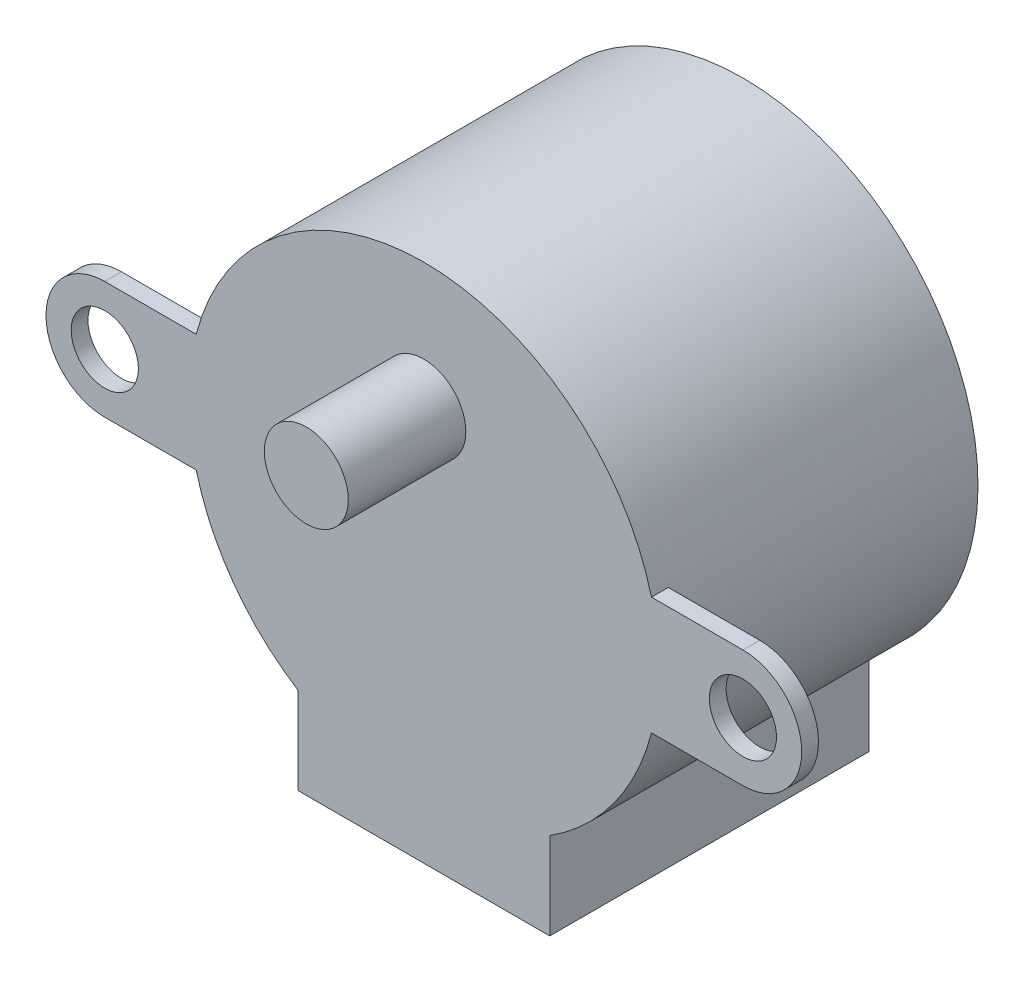
ISO-10303-21;
HEADER;
FILE_DESCRIPTION(('STEP AP214'),'2;1');
FILE_NAME('part.step','',(''),(''),'','','');
FILE_SCHEMA(('AUTOMOTIVE_DESIGN { 1 0 10303 214 1 1 1 1 }'));
ENDSEC;
DATA;
#1=APPLICATION_CONTEXT('core data for automotive mechanical design processes');
#2=APPLICATION_PROTOCOL_DEFINITION('international standard','automotive_design',2000,#1);
#3=PRODUCT_CONTEXT('',#1,'mechanical');
#4=PRODUCT('Part','Part','',(#3));
#5=PRODUCT_RELATED_PRODUCT_CATEGORY('part','',(#4));
#6=PRODUCT_DEFINITION_FORMATION('','',#4);
#7=PRODUCT_DEFINITION_CONTEXT('part definition',#1,'design');
#8=PRODUCT_DEFINITION('design','',#6,#7);
#9=PRODUCT_DEFINITION_SHAPE('','',#8);
#10=(LENGTH_UNIT() NAMED_UNIT(*) SI_UNIT(.MILLI.,.METRE.));
#11=(NAMED_UNIT(*) PLANE_ANGLE_UNIT() SI_UNIT($,.RADIAN.));
#12=(NAMED_UNIT(*) SI_UNIT($,.STERADIAN.) SOLID_ANGLE_UNIT());
#13=UNCERTAINTY_MEASURE_WITH_UNIT(LENGTH_MEASURE(1.E-05),#10,'distance_accuracy_value','');
#14=(GEOMETRIC_REPRESENTATION_CONTEXT(3) GLOBAL_UNCERTAINTY_ASSIGNED_CONTEXT((#13)) GLOBAL_UNIT_ASSIGNED_CONTEXT((#10,
#11,#12)) REPRESENTATION_CONTEXT('',''));
#15=CARTESIAN_POINT('',(0.,0.,0.));
#16=DIRECTION('',(0.,0.,1.));
#17=DIRECTION('',(1.,0.,0.));
#18=AXIS2_PLACEMENT_3D('',#15,#16,#17);
#19=CARTESIAN_POINT('',(19.,0.,19.));
#20=DIRECTION('',(0.,0.,-1.));
#21=DIRECTION('',(-1.,0.,0.));
#22=AXIS2_PLACEMENT_3D('',#19,#20,#21);
#23=CYLINDRICAL_SURFACE('',#22,3.5);
#24=CARTESIAN_POINT('',(19.,0.,18.));
#25=DIRECTION('',(0.,0.,-1.));
#26=DIRECTION('',(-1.,0.,0.));
#27=AXIS2_PLACEMENT_3D('',#24,#25,#26);
#28=CIRCLE('',#27,3.5);
#29=CARTESIAN_POINT('',(19.,3.5,18.));
#30=VERTEX_POINT('',#29);
#31=CARTESIAN_POINT('',(19.,-3.5,18.));
#32=VERTEX_POINT('',#31);
#33=EDGE_CURVE('E49',#30,#32,#28,.T.);
#34=ORIENTED_EDGE('',*,*,#33,.F.);
#35=DIRECTION('',(0.,0.,-1.));
#36=VECTOR('',#35,1.);
#37=CARTESIAN_POINT('',(19.,3.5,19.));
#38=LINE('',#37,#36);
#39=CARTESIAN_POINT('',(19.,3.5,19.));
#40=VERTEX_POINT('',#39);
#41=EDGE_CURVE('E11',#40,#30,#38,.T.);
#42=ORIENTED_EDGE('',*,*,#41,.F.);
#43=CARTESIAN_POINT('',(19.,0.,19.));
#44=DIRECTION('',(0.,0.,1.));
#45=DIRECTION('',(1.,0.,0.));
#46=AXIS2_PLACEMENT_3D('',#43,#44,#45);
#47=CIRCLE('',#46,3.5);
#48=CARTESIAN_POINT('',(19.,-3.5,19.));
#49=VERTEX_POINT('',#48);
#50=EDGE_CURVE('E148',#49,#40,#47,.T.);
#51=ORIENTED_EDGE('',*,*,#50,.F.);
#52=DIRECTION('',(0.,0.,-1.));
#53=VECTOR('',#52,1.);
#54=CARTESIAN_POINT('',(19.,-3.5,19.));
#55=LINE('',#54,#53);
#56=EDGE_CURVE('E135',#49,#32,#55,.T.);
#57=ORIENTED_EDGE('',*,*,#56,.T.);
#58=EDGE_LOOP('',(#34,#42,#51,#57));
#59=FACE_BOUND('',#58,.T.);
#60=ADVANCED_FACE('F33',(#59),#23,.T.);
#61=CARTESIAN_POINT('',(19.,3.5,19.));
#62=DIRECTION('',(0.,-1.,0.));
#63=DIRECTION('',(0.,0.,-1.));
#64=AXIS2_PLACEMENT_3D('',#61,#62,#63);
#65=PLANE('',#64);
#66=DIRECTION('',(1.,0.,0.));
#67=VECTOR('',#66,1.);
#68=CARTESIAN_POINT('',(13.555441711726,3.5,18.));
#69=LINE('',#68,#67);
#70=CARTESIAN_POINT('',(13.555441711726,3.5,18.));
#71=VERTEX_POINT('',#70);
#72=EDGE_CURVE('E250',#71,#30,#69,.T.);
#73=ORIENTED_EDGE('',*,*,#72,.F.);
#74=DIRECTION('',(0.,0.,-1.));
#75=VECTOR('',#74,1.);
#76=CARTESIAN_POINT('',(13.555441711726,3.5,19.));
#77=LINE('',#76,#75);
#78=CARTESIAN_POINT('',(13.555441711726,3.5,19.));
#79=VERTEX_POINT('',#78);
#80=EDGE_CURVE('E41',#79,#71,#77,.T.);
#81=ORIENTED_EDGE('',*,*,#80,.F.);
#82=DIRECTION('',(-1.,0.,0.));
#83=VECTOR('',#82,1.);
#84=CARTESIAN_POINT('',(19.,3.5,19.));
#85=LINE('',#84,#83);
#86=EDGE_CURVE('E87',#40,#79,#85,.T.);
#87=ORIENTED_EDGE('',*,*,#86,.F.);
#88=ORIENTED_EDGE('',*,*,#41,.T.);
#89=EDGE_LOOP('',(#73,#81,#87,#88));
#90=FACE_BOUND('',#89,.T.);
#91=ADVANCED_FACE('F249',(#90),#65,.F.);
#92=CARTESIAN_POINT('',(13.555441711726,-3.5,19.));
#93=DIRECTION('',(0.,1.,0.));
#94=DIRECTION('',(0.,0.,1.));
#95=AXIS2_PLACEMENT_3D('',#92,#93,#94);
#96=PLANE('',#95);
#97=DIRECTION('',(-1.,0.,0.));
#98=VECTOR('',#97,1.);
#99=CARTESIAN_POINT('',(13.555441711726,-3.5,18.));
#100=LINE('',#99,#98);
#101=CARTESIAN_POINT('',(13.555441711726,-3.5,18.));
#102=VERTEX_POINT('',#101);
#103=EDGE_CURVE('E254',#32,#102,#100,.T.);
#104=ORIENTED_EDGE('',*,*,#103,.F.);
#105=ORIENTED_EDGE('',*,*,#56,.F.);
#106=DIRECTION('',(1.,0.,0.));
#107=VECTOR('',#106,1.);
#108=CARTESIAN_POINT('',(13.555441711726,-3.5,19.));
#109=LINE('',#108,#107);
#110=CARTESIAN_POINT('',(13.555441711726,-3.50000000000001,19.));
#111=VERTEX_POINT('',#110);
#112=EDGE_CURVE('E58',#111,#49,#109,.T.);
#113=ORIENTED_EDGE('',*,*,#112,.F.);
#114=DIRECTION('',(0.,0.,-1.));
#115=VECTOR('',#114,1.);
#116=CARTESIAN_POINT('',(13.555441711726,-3.50000000000001,19.));
#117=LINE('',#116,#115);
#118=EDGE_CURVE('E129',#111,#102,#117,.T.);
#119=ORIENTED_EDGE('',*,*,#118,.T.);
#120=EDGE_LOOP('',(#104,#105,#113,#119));
#121=FACE_BOUND('',#120,.T.);
#122=ADVANCED_FACE('F285',(#121),#96,.F.);
#123=CARTESIAN_POINT('',(19.,0.,19.));
#124=DIRECTION('',(0.,0.,-1.));
#125=DIRECTION('',(-1.,0.,0.));
#126=AXIS2_PLACEMENT_3D('',#123,#124,#125);
#127=CYLINDRICAL_SURFACE('',#126,2.);
#128=CARTESIAN_POINT('',(19.,0.,19.));
#129=DIRECTION('',(0.,0.,1.));
#130=DIRECTION('',(1.,0.,0.));
#131=AXIS2_PLACEMENT_3D('',#128,#129,#130);
#132=CIRCLE('',#131,2.);
#133=CARTESIAN_POINT('',(21.,0.,19.));
#134=VERTEX_POINT('',#133);
#135=EDGE_CURVE('E142',#134,#134,#132,.T.);
#136=ORIENTED_EDGE('',*,*,#135,.T.);
#137=EDGE_LOOP('',(#136));
#138=FACE_BOUND('',#137,.T.);
#139=CARTESIAN_POINT('',(19.,0.,18.));
#140=DIRECTION('',(0.,0.,-1.));
#141=DIRECTION('',(-1.,0.,0.));
#142=AXIS2_PLACEMENT_3D('',#139,#140,#141);
#143=CIRCLE('',#142,2.);
#144=CARTESIAN_POINT('',(17.,0.,18.));
#145=VERTEX_POINT('',#144);
#146=EDGE_CURVE('E36',#145,#145,#143,.T.);
#147=ORIENTED_EDGE('',*,*,#146,.T.);
#148=EDGE_LOOP('',(#147));
#149=FACE_BOUND('',#148,.T.);
#150=ADVANCED_FACE('F265',(#138,#149),#127,.F.);
#151=CARTESIAN_POINT('',(-19.,3.5,19.));
#152=DIRECTION('',(0.,-1.,0.));
#153=DIRECTION('',(0.,0.,-1.));
#154=AXIS2_PLACEMENT_3D('',#151,#152,#153);
#155=PLANE('',#154);
#156=DIRECTION('',(1.,0.,0.));
#157=VECTOR('',#156,1.);
#158=CARTESIAN_POINT('',(-13.555441711726,3.5,18.));
#159=LINE('',#158,#157);
#160=CARTESIAN_POINT('',(-19.,3.5,18.));
#161=VERTEX_POINT('',#160);
#162=CARTESIAN_POINT('',(-13.555441711726,3.5,18.));
#163=VERTEX_POINT('',#162);
#164=EDGE_CURVE('E175',#161,#163,#159,.T.);
#165=ORIENTED_EDGE('',*,*,#164,.F.);
#166=DIRECTION('',(0.,0.,-1.));
#167=VECTOR('',#166,1.);
#168=CARTESIAN_POINT('',(-19.,3.5,19.));
#169=LINE('',#168,#167);
#170=CARTESIAN_POINT('',(-19.,3.5,19.));
#171=VERTEX_POINT('',#170);
#172=EDGE_CURVE('E165',#171,#161,#169,.T.);
#173=ORIENTED_EDGE('',*,*,#172,.F.);
#174=DIRECTION('',(-1.,0.,0.));
#175=VECTOR('',#174,1.);
#176=CARTESIAN_POINT('',(-19.,3.5,19.));
#177=LINE('',#176,#175);
#178=CARTESIAN_POINT('',(-13.555441711726,3.5,19.));
#179=VERTEX_POINT('',#178);
#180=EDGE_CURVE('E202',#179,#171,#177,.T.);
#181=ORIENTED_EDGE('',*,*,#180,.F.);
#182=DIRECTION('',(0.,0.,-1.));
#183=VECTOR('',#182,1.);
#184=CARTESIAN_POINT('',(-13.555441711726,3.5,19.));
#185=LINE('',#184,#183);
#186=EDGE_CURVE('E168',#179,#163,#185,.T.);
#187=ORIENTED_EDGE('',*,*,#186,.T.);
#188=EDGE_LOOP('',(#165,#173,#181,#187));
#189=FACE_BOUND('',#188,.T.);
#190=ADVANCED_FACE('F242',(#189),#155,.F.);
#191=CARTESIAN_POINT('',(-19.,0.,19.));
#192=DIRECTION('',(0.,0.,-1.));
#193=DIRECTION('',(-1.,0.,0.));
#194=AXIS2_PLACEMENT_3D('',#191,#192,#193);
#195=CYLINDRICAL_SURFACE('',#194,3.5);
#196=CARTESIAN_POINT('',(-19.,0.,18.));
#197=DIRECTION('',(0.,0.,-1.));
#198=DIRECTION('',(-1.,0.,0.));
#199=AXIS2_PLACEMENT_3D('',#196,#197,#198);
#200=CIRCLE('',#199,3.5);
#201=CARTESIAN_POINT('',(-19.,-3.5,18.));
#202=VERTEX_POINT('',#201);
#203=EDGE_CURVE('E174',#202,#161,#200,.T.);
#204=ORIENTED_EDGE('',*,*,#203,.F.);
#205=DIRECTION('',(0.,0.,-1.));
#206=VECTOR('',#205,1.);
#207=CARTESIAN_POINT('',(-19.,-3.5,19.));
#208=LINE('',#207,#206);
#209=CARTESIAN_POINT('',(-19.,-3.5,19.));
#210=VERTEX_POINT('',#209);
#211=EDGE_CURVE('E162',#210,#202,#208,.T.);
#212=ORIENTED_EDGE('',*,*,#211,.F.);
#213=CARTESIAN_POINT('',(-19.,0.,19.));
#214=DIRECTION('',(0.,0.,1.));
#215=DIRECTION('',(-1.,0.,0.));
#216=AXIS2_PLACEMENT_3D('',#213,#214,#215);
#217=CIRCLE('',#216,3.5);
#218=EDGE_CURVE('E204',#171,#210,#217,.T.);
#219=ORIENTED_EDGE('',*,*,#218,.F.);
#220=ORIENTED_EDGE('',*,*,#172,.T.);
#221=EDGE_LOOP('',(#204,#212,#219,#220));
#222=FACE_BOUND('',#221,.T.);
#223=ADVANCED_FACE('F237',(#222),#195,.T.);
#224=CARTESIAN_POINT('',(-13.555441711726,-3.5,19.));
#225=DIRECTION('',(0.,1.,0.));
#226=DIRECTION('',(0.,0.,1.));
#227=AXIS2_PLACEMENT_3D('',#224,#225,#226);
#228=PLANE('',#227);
#229=DIRECTION('',(-1.,0.,0.));
#230=VECTOR('',#229,1.);
#231=CARTESIAN_POINT('',(-13.555441711726,-3.5,18.));
#232=LINE('',#231,#230);
#233=CARTESIAN_POINT('',(-13.555441711726,-3.5,18.));
#234=VERTEX_POINT('',#233);
#235=EDGE_CURVE('E182',#234,#202,#232,.T.);
#236=ORIENTED_EDGE('',*,*,#235,.F.);
#237=DIRECTION('',(0.,0.,-1.));
#238=VECTOR('',#237,1.);
#239=CARTESIAN_POINT('',(-13.555441711726,-3.5,19.));
#240=LINE('',#239,#238);
#241=CARTESIAN_POINT('',(-13.555441711726,-3.5,19.));
#242=VERTEX_POINT('',#241);
#243=EDGE_CURVE('E159',#242,#234,#240,.T.);
#244=ORIENTED_EDGE('',*,*,#243,.F.);
#245=DIRECTION('',(1.,0.,0.));
#246=VECTOR('',#245,1.);
#247=CARTESIAN_POINT('',(-13.555441711726,-3.5,19.));
#248=LINE('',#247,#246);
#249=EDGE_CURVE('E206',#210,#242,#248,.T.);
#250=ORIENTED_EDGE('',*,*,#249,.F.);
#251=ORIENTED_EDGE('',*,*,#211,.T.);
#252=EDGE_LOOP('',(#236,#244,#250,#251));
#253=FACE_BOUND('',#252,.T.);
#254=ADVANCED_FACE('F231',(#253),#228,.F.);
#255=CARTESIAN_POINT('',(-19.,0.,19.));
#256=DIRECTION('',(0.,0.,-1.));
#257=DIRECTION('',(-1.,0.,0.));
#258=AXIS2_PLACEMENT_3D('',#255,#256,#257);
#259=CYLINDRICAL_SURFACE('',#258,2.);
#260=CARTESIAN_POINT('',(-19.,0.,19.));
#261=DIRECTION('',(0.,0.,1.));
#262=DIRECTION('',(-1.,0.,0.));
#263=AXIS2_PLACEMENT_3D('',#260,#261,#262);
#264=CIRCLE('',#263,2.);
#265=CARTESIAN_POINT('',(-21.,0.,19.));
#266=VERTEX_POINT('',#265);
#267=EDGE_CURVE('E179',#266,#266,#264,.T.);
#268=ORIENTED_EDGE('',*,*,#267,.T.);
#269=EDGE_LOOP('',(#268));
#270=FACE_BOUND('',#269,.T.);
#271=CARTESIAN_POINT('',(-19.,0.,18.));
#272=DIRECTION('',(0.,0.,-1.));
#273=DIRECTION('',(-1.,0.,0.));
#274=AXIS2_PLACEMENT_3D('',#271,#272,#273);
#275=CIRCLE('',#274,2.);
#276=CARTESIAN_POINT('',(-21.,0.,18.));
#277=VERTEX_POINT('',#276);
#278=EDGE_CURVE('E172',#277,#277,#275,.T.);
#279=ORIENTED_EDGE('',*,*,#278,.T.);
#280=EDGE_LOOP('',(#279));
#281=FACE_BOUND('',#280,.T.);
#282=ADVANCED_FACE('F309',(#270,#281),#259,.F.);
#283=CARTESIAN_POINT('',(19.,0.,19.));
#284=DIRECTION('',(0.,0.,1.));
#285=DIRECTION('',(1.,0.,0.));
#286=AXIS2_PLACEMENT_3D('',#283,#284,#285);
#287=PLANE('',#286);
#288=CARTESIAN_POINT('',(0.,6.5,19.));
#289=DIRECTION('',(0.,0.,1.));
#290=DIRECTION('',(1.,0.,0.));
#291=AXIS2_PLACEMENT_3D('',#288,#289,#290);
#292=CIRCLE('',#291,2.5);
#293=CARTESIAN_POINT('',(2.5,6.5,19.));
#294=VERTEX_POINT('',#293);
#295=EDGE_CURVE('E390',#294,#294,#292,.T.);
#296=ORIENTED_EDGE('',*,*,#295,.F.);
#297=EDGE_LOOP('',(#296));
#298=FACE_BOUND('',#297,.T.);
#299=ORIENTED_EDGE('',*,*,#135,.F.);
#300=EDGE_LOOP('',(#299));
#301=FACE_BOUND('',#300,.T.);
#302=ORIENTED_EDGE('',*,*,#50,.T.);
#303=ORIENTED_EDGE('',*,*,#86,.T.);
#304=CARTESIAN_POINT('',(0.,0.,19.));
#305=DIRECTION('',(0.,0.,1.));
#306=DIRECTION('',(1.,0.,0.));
#307=AXIS2_PLACEMENT_3D('',#304,#305,#306);
#308=CIRCLE('',#307,14.);
#309=EDGE_CURVE('E200',#79,#179,#308,.T.);
#310=ORIENTED_EDGE('',*,*,#309,.T.);
#311=ORIENTED_EDGE('',*,*,#180,.T.);
#312=ORIENTED_EDGE('',*,*,#218,.T.);
#313=ORIENTED_EDGE('',*,*,#249,.T.);
#314=CARTESIAN_POINT('',(0.,0.,19.));
#315=DIRECTION('',(0.,0.,1.));
#316=DIRECTION('',(1.,0.,0.));
#317=AXIS2_PLACEMENT_3D('',#314,#315,#316);
#318=CIRCLE('',#317,14.);
#319=CARTESIAN_POINT('',(-7.5,-11.8215904175369,19.));
#320=VERTEX_POINT('',#319);
#321=EDGE_CURVE('E208',#242,#320,#318,.T.);
#322=ORIENTED_EDGE('',*,*,#321,.T.);
#323=DIRECTION('',(0.,-1.,0.));
#324=VECTOR('',#323,1.);
#325=CARTESIAN_POINT('',(-7.5,-14.,19.));
#326=LINE('',#325,#324);
#327=CARTESIAN_POINT('',(-7.5,-17.,19.));
#328=VERTEX_POINT('',#327);
#329=EDGE_CURVE('E210',#320,#328,#326,.T.);
#330=ORIENTED_EDGE('',*,*,#329,.T.);
#331=DIRECTION('',(1.,0.,0.));
#332=VECTOR('',#331,1.);
#333=CARTESIAN_POINT('',(7.5,-17.,19.));
#334=LINE('',#333,#332);
#335=CARTESIAN_POINT('',(7.5,-17.,19.));
#336=VERTEX_POINT('',#335);
#337=EDGE_CURVE('E121',#328,#336,#334,.T.);
#338=ORIENTED_EDGE('',*,*,#337,.T.);
#339=DIRECTION('',(0.,1.,0.));
#340=VECTOR('',#339,1.);
#341=CARTESIAN_POINT('',(7.5,-14.,19.));
#342=LINE('',#341,#340);
#343=CARTESIAN_POINT('',(7.5,-11.8215904175369,19.));
#344=VERTEX_POINT('',#343);
#345=EDGE_CURVE('E114',#336,#344,#342,.T.);
#346=ORIENTED_EDGE('',*,*,#345,.T.);
#347=CARTESIAN_POINT('',(0.,0.,19.));
#348=DIRECTION('',(0.,0.,1.));
#349=DIRECTION('',(1.,0.,0.));
#350=AXIS2_PLACEMENT_3D('',#347,#348,#349);
#351=CIRCLE('',#350,14.);
#352=EDGE_CURVE('E118',#344,#111,#351,.T.);
#353=ORIENTED_EDGE('',*,*,#352,.T.);
#354=ORIENTED_EDGE('',*,*,#112,.T.);
#355=EDGE_LOOP('',(#302,#303,#310,#311,#312,#313,#322,#330,#338,#346,#353,#354));
#356=FACE_BOUND('',#355,.T.);
#357=ORIENTED_EDGE('',*,*,#267,.F.);
#358=EDGE_LOOP('',(#357));
#359=FACE_BOUND('',#358,.T.);
#360=ADVANCED_FACE('F115',(#298,#301,#356,#359),#287,.T.);
#361=CARTESIAN_POINT('',(19.,0.,0.));
#362=DIRECTION('',(0.,0.,1.));
#363=DIRECTION('',(1.,0.,0.));
#364=AXIS2_PLACEMENT_3D('',#361,#362,#363);
#365=PLANE('',#364);
#366=DIRECTION('',(0.,-1.,0.));
#367=VECTOR('',#366,1.);
#368=CARTESIAN_POINT('',(-7.5,-14.,0.));
#369=LINE('',#368,#367);
#370=CARTESIAN_POINT('',(-7.5,-11.8215904175369,0.));
#371=VERTEX_POINT('',#370);
#372=CARTESIAN_POINT('',(-7.5,-17.,0.));
#373=VERTEX_POINT('',#372);
#374=EDGE_CURVE('E139',#371,#373,#369,.T.);
#375=ORIENTED_EDGE('',*,*,#374,.F.);
#376=CARTESIAN_POINT('',(0.,0.,0.));
#377=DIRECTION('',(0.,0.,1.));
#378=DIRECTION('',(1.,0.,0.));
#379=AXIS2_PLACEMENT_3D('',#376,#377,#378);
#380=CIRCLE('',#379,14.);
#381=CARTESIAN_POINT('',(7.5,-11.8215904175369,0.));
#382=VERTEX_POINT('',#381);
#383=EDGE_CURVE('E146',#382,#371,#380,.T.);
#384=ORIENTED_EDGE('',*,*,#383,.F.);
#385=DIRECTION('',(0.,1.,0.));
#386=VECTOR('',#385,1.);
#387=CARTESIAN_POINT('',(7.5,-14.,0.));
#388=LINE('',#387,#386);
#389=CARTESIAN_POINT('',(7.5,-17.,0.));
#390=VERTEX_POINT('',#389);
#391=EDGE_CURVE('E79',#390,#382,#388,.T.);
#392=ORIENTED_EDGE('',*,*,#391,.F.);
#393=DIRECTION('',(1.,0.,0.));
#394=VECTOR('',#393,1.);
#395=CARTESIAN_POINT('',(7.5,-17.,0.));
#396=LINE('',#395,#394);
#397=EDGE_CURVE('E141',#373,#390,#396,.T.);
#398=ORIENTED_EDGE('',*,*,#397,.F.);
#399=EDGE_LOOP('',(#375,#384,#392,#398));
#400=FACE_BOUND('',#399,.T.);
#401=ADVANCED_FACE('F222',(#400),#365,.F.);
#402=CARTESIAN_POINT('',(-7.5,-14.,19.));
#403=DIRECTION('',(1.,0.,0.));
#404=DIRECTION('',(0.,0.,-1.));
#405=AXIS2_PLACEMENT_3D('',#402,#403,#404);
#406=PLANE('',#405);
#407=ORIENTED_EDGE('',*,*,#374,.T.);
#408=DIRECTION('',(0.,0.,-1.));
#409=VECTOR('',#408,1.);
#410=CARTESIAN_POINT('',(-7.5,-17.,19.));
#411=LINE('',#410,#409);
#412=EDGE_CURVE('E153',#328,#373,#411,.T.);
#413=ORIENTED_EDGE('',*,*,#412,.F.);
#414=ORIENTED_EDGE('',*,*,#329,.F.);
#415=DIRECTION('',(0.,0.,-1.));
#416=VECTOR('',#415,1.);
#417=CARTESIAN_POINT('',(-7.5,-11.8215904175369,19.));
#418=LINE('',#417,#416);
#419=EDGE_CURVE('E156',#320,#371,#418,.T.);
#420=ORIENTED_EDGE('',*,*,#419,.T.);
#421=EDGE_LOOP('',(#407,#413,#414,#420));
#422=FACE_BOUND('',#421,.T.);
#423=ADVANCED_FACE('F216',(#422),#406,.F.);
#424=CARTESIAN_POINT('',(7.5,-17.,19.));
#425=DIRECTION('',(0.,1.,0.));
#426=DIRECTION('',(0.,0.,1.));
#427=AXIS2_PLACEMENT_3D('',#424,#425,#426);
#428=PLANE('',#427);
#429=ORIENTED_EDGE('',*,*,#397,.T.);
#430=DIRECTION('',(0.,0.,-1.));
#431=VECTOR('',#430,1.);
#432=CARTESIAN_POINT('',(7.5,-17.,19.));
#433=LINE('',#432,#431);
#434=EDGE_CURVE('E128',#336,#390,#433,.T.);
#435=ORIENTED_EDGE('',*,*,#434,.F.);
#436=ORIENTED_EDGE('',*,*,#337,.F.);
#437=ORIENTED_EDGE('',*,*,#412,.T.);
#438=EDGE_LOOP('',(#429,#435,#436,#437));
#439=FACE_BOUND('',#438,.T.);
#440=ADVANCED_FACE('F220',(#439),#428,.F.);
#441=CARTESIAN_POINT('',(7.5,-14.,19.));
#442=DIRECTION('',(-1.,0.,0.));
#443=DIRECTION('',(0.,0.,1.));
#444=AXIS2_PLACEMENT_3D('',#441,#442,#443);
#445=PLANE('',#444);
#446=ORIENTED_EDGE('',*,*,#391,.T.);
#447=DIRECTION('',(0.,0.,-1.));
#448=VECTOR('',#447,1.);
#449=CARTESIAN_POINT('',(7.5,-11.8215904175369,19.));
#450=LINE('',#449,#448);
#451=EDGE_CURVE('E124',#344,#382,#450,.T.);
#452=ORIENTED_EDGE('',*,*,#451,.F.);
#453=ORIENTED_EDGE('',*,*,#345,.F.);
#454=ORIENTED_EDGE('',*,*,#434,.T.);
#455=EDGE_LOOP('',(#446,#452,#453,#454));
#456=FACE_BOUND('',#455,.T.);
#457=ADVANCED_FACE('F125',(#456),#445,.F.);
#458=CARTESIAN_POINT('',(0.,0.,19.));
#459=DIRECTION('',(0.,0.,-1.));
#460=DIRECTION('',(-1.,0.,0.));
#461=AXIS2_PLACEMENT_3D('',#458,#459,#460);
#462=CYLINDRICAL_SURFACE('',#461,14.);
#463=ORIENTED_EDGE('',*,*,#383,.T.);
#464=ORIENTED_EDGE('',*,*,#419,.F.);
#465=ORIENTED_EDGE('',*,*,#321,.F.);
#466=ORIENTED_EDGE('',*,*,#243,.T.);
#467=CARTESIAN_POINT('',(0.,0.,18.));
#468=DIRECTION('',(0.,0.,1.));
#469=DIRECTION('',(-1.,0.,0.));
#470=AXIS2_PLACEMENT_3D('',#467,#468,#469);
#471=CIRCLE('',#470,14.);
#472=EDGE_CURVE('E190',#163,#234,#471,.T.);
#473=ORIENTED_EDGE('',*,*,#472,.F.);
#474=ORIENTED_EDGE('',*,*,#186,.F.);
#475=ORIENTED_EDGE('',*,*,#309,.F.);
#476=ORIENTED_EDGE('',*,*,#80,.T.);
#477=CARTESIAN_POINT('',(0.,0.,18.));
#478=DIRECTION('',(0.,0.,1.));
#479=DIRECTION('',(-1.,0.,0.));
#480=AXIS2_PLACEMENT_3D('',#477,#478,#479);
#481=CIRCLE('',#480,14.);
#482=EDGE_CURVE('E255',#102,#71,#481,.T.);
#483=ORIENTED_EDGE('',*,*,#482,.F.);
#484=ORIENTED_EDGE('',*,*,#118,.F.);
#485=ORIENTED_EDGE('',*,*,#352,.F.);
#486=ORIENTED_EDGE('',*,*,#451,.T.);
#487=EDGE_LOOP('',(#463,#464,#465,#466,#473,#474,#475,#476,#483,#484,#485,#486));
#488=FACE_BOUND('',#487,.T.);
#489=ADVANCED_FACE('F131',(#488),#462,.T.);
#490=CARTESIAN_POINT('',(0.,0.,18.));
#491=DIRECTION('',(0.,0.,-1.));
#492=DIRECTION('',(-1.,0.,0.));
#493=AXIS2_PLACEMENT_3D('',#490,#491,#492);
#494=PLANE('',#493);
#495=ORIENTED_EDGE('',*,*,#278,.F.);
#496=EDGE_LOOP('',(#495));
#497=FACE_BOUND('',#496,.T.);
#498=ORIENTED_EDGE('',*,*,#203,.T.);
#499=ORIENTED_EDGE('',*,*,#164,.T.);
#500=ORIENTED_EDGE('',*,*,#472,.T.);
#501=ORIENTED_EDGE('',*,*,#235,.T.);
#502=EDGE_LOOP('',(#498,#499,#500,#501));
#503=FACE_BOUND('',#502,.T.);
#504=ADVANCED_FACE('F234',(#497,#503),#494,.T.);
#505=CARTESIAN_POINT('',(0.,0.,18.));
#506=DIRECTION('',(0.,0.,-1.));
#507=DIRECTION('',(-1.,0.,0.));
#508=AXIS2_PLACEMENT_3D('',#505,#506,#507);
#509=PLANE('',#508);
#510=ORIENTED_EDGE('',*,*,#146,.F.);
#511=EDGE_LOOP('',(#510));
#512=FACE_BOUND('',#511,.T.);
#513=ORIENTED_EDGE('',*,*,#33,.T.);
#514=ORIENTED_EDGE('',*,*,#103,.T.);
#515=ORIENTED_EDGE('',*,*,#482,.T.);
#516=ORIENTED_EDGE('',*,*,#72,.T.);
#517=EDGE_LOOP('',(#513,#514,#515,#516));
#518=FACE_BOUND('',#517,.T.);
#519=ADVANCED_FACE('F267',(#512,#518),#509,.T.);
#520=CARTESIAN_POINT('',(0.,6.5,26.));
#521=DIRECTION('',(0.,0.,-1.));
#522=DIRECTION('',(-1.,0.,0.));
#523=AXIS2_PLACEMENT_3D('',#520,#521,#522);
#524=CYLINDRICAL_SURFACE('',#523,2.5);
#525=CARTESIAN_POINT('',(0.,6.5,26.));
#526=DIRECTION('',(0.,0.,1.));
#527=DIRECTION('',(1.,0.,0.));
#528=AXIS2_PLACEMENT_3D('',#525,#526,#527);
#529=CIRCLE('',#528,2.5);
#530=CARTESIAN_POINT('',(2.5,6.5,26.));
#531=VERTEX_POINT('',#530);
#532=EDGE_CURVE('E258',#531,#531,#529,.T.);
#533=ORIENTED_EDGE('',*,*,#532,.F.);
#534=EDGE_LOOP('',(#533));
#535=FACE_BOUND('',#534,.T.);
#536=ORIENTED_EDGE('',*,*,#295,.T.);
#537=EDGE_LOOP('',(#536));
#538=FACE_BOUND('',#537,.T.);
#539=ADVANCED_FACE('F269',(#535,#538),#524,.T.);
#540=CARTESIAN_POINT('',(0.,6.5,26.));
#541=DIRECTION('',(0.,0.,1.));
#542=DIRECTION('',(1.,0.,0.));
#543=AXIS2_PLACEMENT_3D('',#540,#541,#542);
#544=PLANE('',#543);
#545=ORIENTED_EDGE('',*,*,#532,.T.);
#546=EDGE_LOOP('',(#545));
#547=FACE_BOUND('',#546,.T.);
#548=ADVANCED_FACE('F275',(#547),#544,.T.);
#549=CLOSED_SHELL('',(#60,#91,#122,#150,#190,#223,#254,#282,#360,#401,#423,#440,#457,#489,#504,
#519,#539,#548));
#550=MANIFOLD_SOLID_BREP('B2',#549);
#551=ADVANCED_BREP_SHAPE_REPRESENTATION('',(#18,#550),#14);
#552=SHAPE_DEFINITION_REPRESENTATION(#9,#551);
ENDSEC;
END-ISO-10303-21;
